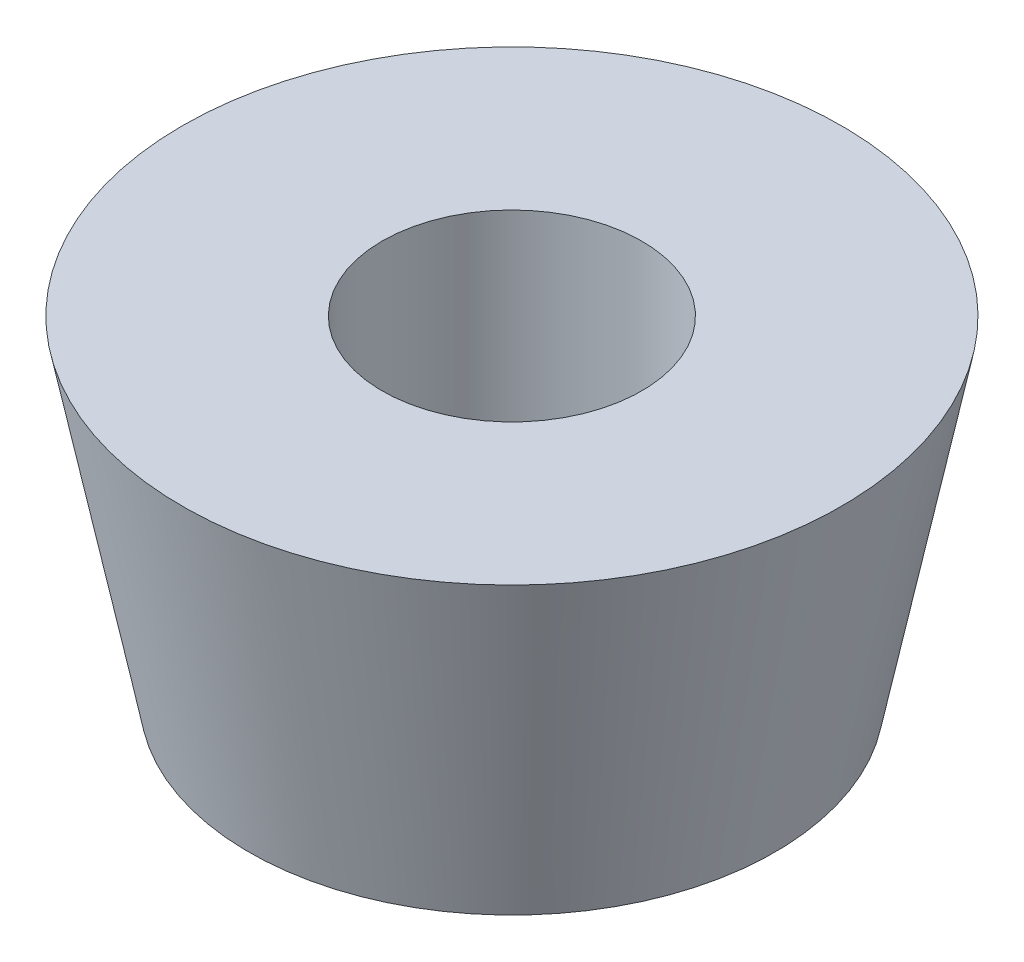
ISO-10303-21;
HEADER;
FILE_DESCRIPTION(('STEP AP214'),'2;1');
FILE_NAME('part.step','',(''),(''),'','','');
FILE_SCHEMA(('AUTOMOTIVE_DESIGN { 1 0 10303 214 1 1 1 1 }'));
ENDSEC;
DATA;
#1=APPLICATION_CONTEXT('core data for automotive mechanical design processes');
#2=APPLICATION_PROTOCOL_DEFINITION('international standard','automotive_design',2000,#1);
#3=PRODUCT_CONTEXT('',#1,'mechanical');
#4=PRODUCT('Part','Part','',(#3));
#5=PRODUCT_RELATED_PRODUCT_CATEGORY('part','',(#4));
#6=PRODUCT_DEFINITION_FORMATION('','',#4);
#7=PRODUCT_DEFINITION_CONTEXT('part definition',#1,'design');
#8=PRODUCT_DEFINITION('design','',#6,#7);
#9=PRODUCT_DEFINITION_SHAPE('','',#8);
#10=(LENGTH_UNIT() NAMED_UNIT(*) SI_UNIT(.MILLI.,.METRE.));
#11=(NAMED_UNIT(*) PLANE_ANGLE_UNIT() SI_UNIT($,.RADIAN.));
#12=(NAMED_UNIT(*) SI_UNIT($,.STERADIAN.) SOLID_ANGLE_UNIT());
#13=UNCERTAINTY_MEASURE_WITH_UNIT(LENGTH_MEASURE(1.E-05),#10,'distance_accuracy_value','');
#14=(GEOMETRIC_REPRESENTATION_CONTEXT(3) GLOBAL_UNCERTAINTY_ASSIGNED_CONTEXT((#13)) GLOBAL_UNIT_ASSIGNED_CONTEXT((#10,
#11,#12)) REPRESENTATION_CONTEXT('',''));
#15=CARTESIAN_POINT('',(0.,0.,0.));
#16=DIRECTION('',(0.,0.,1.));
#17=DIRECTION('',(1.,0.,0.));
#18=AXIS2_PLACEMENT_3D('',#15,#16,#17);
#19=CARTESIAN_POINT('',(4.95,0.,0.));
#20=DIRECTION('',(0.,-1.,0.));
#21=DIRECTION('',(1.,0.,0.));
#22=AXIS2_PLACEMENT_3D('',#19,#20,#21);
#23=PLANE('',#22);
#24=CARTESIAN_POINT('',(0.,0.,0.));
#25=DIRECTION('',(0.,1.,0.));
#26=DIRECTION('',(-1.,0.,0.));
#27=AXIS2_PLACEMENT_3D('',#24,#25,#26);
#28=CIRCLE('',#27,1.95);
#29=CARTESIAN_POINT('',(-1.95,0.,0.));
#30=VERTEX_POINT('',#29);
#31=EDGE_CURVE('E10',#30,#30,#28,.T.);
#32=ORIENTED_EDGE('',*,*,#31,.F.);
#33=EDGE_LOOP('',(#32));
#34=FACE_BOUND('',#33,.T.);
#35=CARTESIAN_POINT('',(0.,0.,0.));
#36=DIRECTION('',(0.,1.,0.));
#37=DIRECTION('',(-1.,0.,0.));
#38=AXIS2_PLACEMENT_3D('',#35,#36,#37);
#39=CIRCLE('',#38,4.95);
#40=CARTESIAN_POINT('',(-4.95,0.,0.));
#41=VERTEX_POINT('',#40);
#42=EDGE_CURVE('E56',#41,#41,#39,.T.);
#43=ORIENTED_EDGE('',*,*,#42,.T.);
#44=EDGE_LOOP('',(#43));
#45=FACE_BOUND('',#44,.T.);
#46=ADVANCED_FACE('F39',(#34,#45),#23,.F.);
#47=CARTESIAN_POINT('',(0.,0.,0.));
#48=DIRECTION('',(0.,1.,0.));
#49=DIRECTION('',(-1.,0.,0.));
#50=AXIS2_PLACEMENT_3D('',#47,#48,#49);
#51=CYLINDRICAL_SURFACE('',#50,1.95);
#52=CARTESIAN_POINT('',(0.,-5.,0.));
#53=DIRECTION('',(0.,1.,0.));
#54=DIRECTION('',(-1.,0.,0.));
#55=AXIS2_PLACEMENT_3D('',#52,#53,#54);
#56=CIRCLE('',#55,1.95);
#57=CARTESIAN_POINT('',(-1.95,-5.,0.));
#58=VERTEX_POINT('',#57);
#59=EDGE_CURVE('E46',#58,#58,#56,.T.);
#60=ORIENTED_EDGE('',*,*,#59,.F.);
#61=EDGE_LOOP('',(#60));
#62=FACE_BOUND('',#61,.T.);
#63=ORIENTED_EDGE('',*,*,#31,.T.);
#64=EDGE_LOOP('',(#63));
#65=FACE_BOUND('',#64,.T.);
#66=ADVANCED_FACE('F72',(#62,#65),#51,.F.);
#67=CARTESIAN_POINT('',(1.95,-5.,0.));
#68=DIRECTION('',(0.,1.,0.));
#69=DIRECTION('',(-1.,0.,0.));
#70=AXIS2_PLACEMENT_3D('',#67,#68,#69);
#71=PLANE('',#70);
#72=CARTESIAN_POINT('',(0.,-5.,0.));
#73=DIRECTION('',(0.,1.,0.));
#74=DIRECTION('',(-1.,0.,0.));
#75=AXIS2_PLACEMENT_3D('',#72,#73,#74);
#76=CIRCLE('',#75,3.95);
#77=CARTESIAN_POINT('',(-3.95,-5.,0.));
#78=VERTEX_POINT('',#77);
#79=EDGE_CURVE('E51',#78,#78,#76,.T.);
#80=ORIENTED_EDGE('',*,*,#79,.F.);
#81=EDGE_LOOP('',(#80));
#82=FACE_BOUND('',#81,.T.);
#83=ORIENTED_EDGE('',*,*,#59,.T.);
#84=EDGE_LOOP('',(#83));
#85=FACE_BOUND('',#84,.T.);
#86=ADVANCED_FACE('F67',(#82,#85),#71,.F.);
#87=CARTESIAN_POINT('',(0.,-5.,0.));
#88=DIRECTION('',(0.,1.,0.));
#89=DIRECTION('',(-1.,0.,0.));
#90=AXIS2_PLACEMENT_3D('',#87,#88,#89);
#91=CONICAL_SURFACE('',#90,3.95,0.197395559849881);
#92=ORIENTED_EDGE('',*,*,#42,.F.);
#93=EDGE_LOOP('',(#92));
#94=FACE_BOUND('',#93,.T.);
#95=ORIENTED_EDGE('',*,*,#79,.T.);
#96=EDGE_LOOP('',(#95));
#97=FACE_BOUND('',#96,.T.);
#98=ADVANCED_FACE('F64',(#94,#97),#91,.T.);
#99=CLOSED_SHELL('',(#46,#66,#86,#98));
#100=MANIFOLD_SOLID_BREP('B2',#99);
#101=ADVANCED_BREP_SHAPE_REPRESENTATION('',(#18,#100),#14);
#102=SHAPE_DEFINITION_REPRESENTATION(#9,#101);
ENDSEC;
END-ISO-10303-21;
